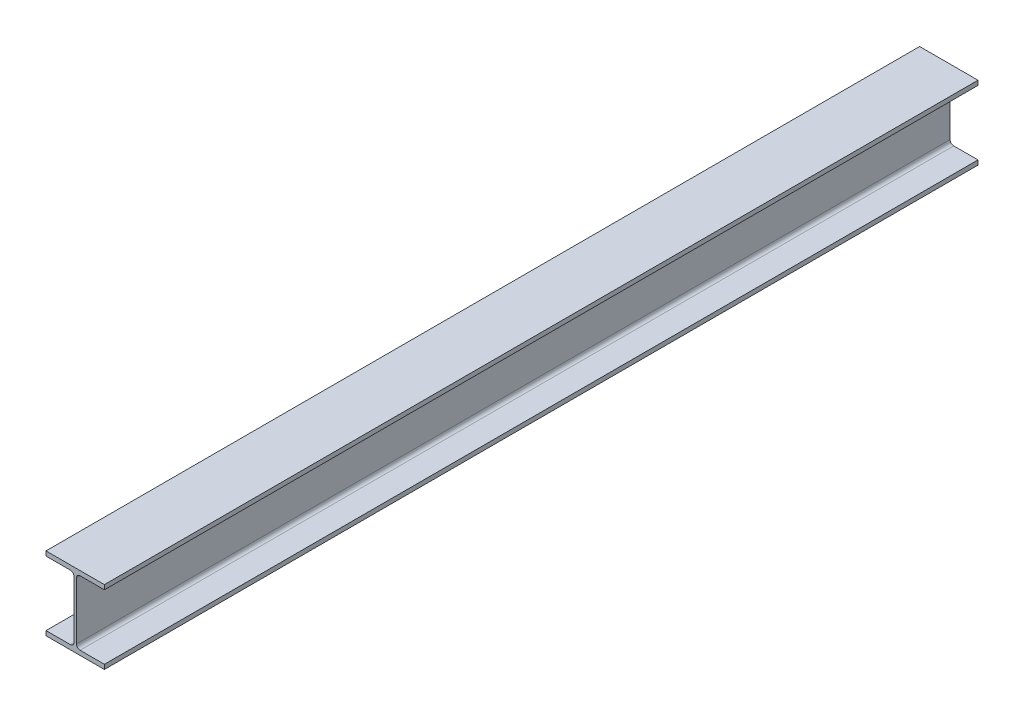
ISO-10303-21;
HEADER;
FILE_DESCRIPTION(('STEP AP214'),'2;1');
FILE_NAME('part.step','',(''),(''),'','','');
FILE_SCHEMA(('AUTOMOTIVE_DESIGN { 1 0 10303 214 1 1 1 1 }'));
ENDSEC;
DATA;
#1=APPLICATION_CONTEXT('core data for automotive mechanical design processes');
#2=APPLICATION_PROTOCOL_DEFINITION('international standard','automotive_design',2000,#1);
#3=PRODUCT_CONTEXT('',#1,'mechanical');
#4=PRODUCT('Part','Part','',(#3));
#5=PRODUCT_RELATED_PRODUCT_CATEGORY('part','',(#4));
#6=PRODUCT_DEFINITION_FORMATION('','',#4);
#7=PRODUCT_DEFINITION_CONTEXT('part definition',#1,'design');
#8=PRODUCT_DEFINITION('design','',#6,#7);
#9=PRODUCT_DEFINITION_SHAPE('','',#8);
#10=(LENGTH_UNIT() NAMED_UNIT(*) SI_UNIT(.MILLI.,.METRE.));
#11=(NAMED_UNIT(*) PLANE_ANGLE_UNIT() SI_UNIT($,.RADIAN.));
#12=(NAMED_UNIT(*) SI_UNIT($,.STERADIAN.) SOLID_ANGLE_UNIT());
#13=UNCERTAINTY_MEASURE_WITH_UNIT(LENGTH_MEASURE(1.E-05),#10,'distance_accuracy_value','');
#14=(GEOMETRIC_REPRESENTATION_CONTEXT(3) GLOBAL_UNCERTAINTY_ASSIGNED_CONTEXT((#13)) GLOBAL_UNIT_ASSIGNED_CONTEXT((#10,
#11,#12)) REPRESENTATION_CONTEXT('',''));
#15=CARTESIAN_POINT('',(0.,0.,0.));
#16=DIRECTION('',(0.,0.,1.));
#17=DIRECTION('',(1.,0.,0.));
#18=AXIS2_PLACEMENT_3D('',#15,#16,#17);
#19=CARTESIAN_POINT('',(183.500636302133,10.8236048524095,-1520.69024698075));
#20=DIRECTION('',(0.,-1.,0.));
#21=DIRECTION('',(0.,0.,-1.));
#22=AXIS2_PLACEMENT_3D('',#19,#20,#21);
#23=PLANE('',#22);
#24=DIRECTION('',(1.,0.,0.));
#25=VECTOR('',#24,1.);
#26=CARTESIAN_POINT('',(183.500636302133,10.8236048524095,1527.30975301925));
#27=LINE('',#26,#25);
#28=CARTESIAN_POINT('',(-20.207363697867,10.8236048524095,1527.30975301925));
#29=VERTEX_POINT('',#28);
#30=CARTESIAN_POINT('',(183.500636302133,10.8236048524095,1527.30975301925));
#31=VERTEX_POINT('',#30);
#32=EDGE_CURVE('E207',#29,#31,#27,.T.);
#33=ORIENTED_EDGE('',*,*,#32,.F.);
#34=DIRECTION('',(0.,0.,1.));
#35=VECTOR('',#34,1.);
#36=CARTESIAN_POINT('',(-20.207363697867,10.8236048524095,-1520.69024698075));
#37=LINE('',#36,#35);
#38=CARTESIAN_POINT('',(-20.207363697867,10.8236048524095,-1520.69024698075));
#39=VERTEX_POINT('',#38);
#40=EDGE_CURVE('E11',#39,#29,#37,.T.);
#41=ORIENTED_EDGE('',*,*,#40,.F.);
#42=DIRECTION('',(1.,0.,0.));
#43=VECTOR('',#42,1.);
#44=CARTESIAN_POINT('',(183.500636302133,10.8236048524095,-1520.69024698075));
#45=LINE('',#44,#43);
#46=CARTESIAN_POINT('',(183.500636302133,10.8236048524095,-1520.69024698075));
#47=VERTEX_POINT('',#46);
#48=EDGE_CURVE('E251',#39,#47,#45,.T.);
#49=ORIENTED_EDGE('',*,*,#48,.T.);
#50=DIRECTION('',(0.,0.,1.));
#51=VECTOR('',#50,1.);
#52=CARTESIAN_POINT('',(183.500636302133,10.8236048524095,-1520.69024698075));
#53=LINE('',#52,#51);
#54=EDGE_CURVE('E43',#47,#31,#53,.T.);
#55=ORIENTED_EDGE('',*,*,#54,.T.);
#56=EDGE_LOOP('',(#33,#41,#49,#55));
#57=FACE_BOUND('',#56,.T.);
#58=ADVANCED_FACE('F40',(#57),#23,.T.);
#59=CARTESIAN_POINT('',(-20.207363697867,10.8236048524095,-1520.69024698075));
#60=DIRECTION('',(-1.,0.,0.));
#61=DIRECTION('',(0.,-1.,0.));
#62=AXIS2_PLACEMENT_3D('',#59,#60,#61);
#63=PLANE('',#62);
#64=DIRECTION('',(0.,-1.,0.));
#65=VECTOR('',#64,1.);
#66=CARTESIAN_POINT('',(-20.207363697867,10.8236048524095,1527.30975301925));
#67=LINE('',#66,#65);
#68=CARTESIAN_POINT('',(-20.207363697867,26.5716048524095,1527.30975301925));
#69=VERTEX_POINT('',#68);
#70=EDGE_CURVE('E249',#69,#29,#67,.T.);
#71=ORIENTED_EDGE('',*,*,#70,.F.);
#72=DIRECTION('',(0.,0.,1.));
#73=VECTOR('',#72,1.);
#74=CARTESIAN_POINT('',(-20.207363697867,26.5716048524095,-1520.69024698075));
#75=LINE('',#74,#73);
#76=CARTESIAN_POINT('',(-20.207363697867,26.5716048524095,-1520.69024698075));
#77=VERTEX_POINT('',#76);
#78=EDGE_CURVE('E50',#77,#69,#75,.T.);
#79=ORIENTED_EDGE('',*,*,#78,.F.);
#80=DIRECTION('',(0.,-1.,0.));
#81=VECTOR('',#80,1.);
#82=CARTESIAN_POINT('',(-20.207363697867,10.8236048524095,-1520.69024698075));
#83=LINE('',#82,#81);
#84=EDGE_CURVE('E193',#77,#39,#83,.T.);
#85=ORIENTED_EDGE('',*,*,#84,.T.);
#86=ORIENTED_EDGE('',*,*,#40,.T.);
#87=EDGE_LOOP('',(#71,#79,#85,#86));
#88=FACE_BOUND('',#87,.T.);
#89=ADVANCED_FACE('F293',(#88),#63,.T.);
#90=CARTESIAN_POINT('',(-20.207363697867,26.5716048524095,-1520.69024698075));
#91=DIRECTION('',(0.,1.,0.));
#92=DIRECTION('',(-1.,0.,0.));
#93=AXIS2_PLACEMENT_3D('',#90,#91,#92);
#94=PLANE('',#93);
#95=DIRECTION('',(-1.,0.,0.));
#96=VECTOR('',#95,1.);
#97=CARTESIAN_POINT('',(-20.207363697867,26.5716048524095,1527.30975301925));
#98=LINE('',#97,#96);
#99=CARTESIAN_POINT('',(64.501636302133,26.5716048524095,1527.30975301925));
#100=VERTEX_POINT('',#99);
#101=EDGE_CURVE('E179',#100,#69,#98,.T.);
#102=ORIENTED_EDGE('',*,*,#101,.F.);
#103=DIRECTION('',(0.,0.,1.));
#104=VECTOR('',#103,1.);
#105=CARTESIAN_POINT('',(64.501636302133,26.5716048524095,-1520.69024698075));
#106=LINE('',#105,#104);
#107=CARTESIAN_POINT('',(64.501636302133,26.5716048524095,-1520.69024698075));
#108=VERTEX_POINT('',#107);
#109=EDGE_CURVE('E174',#108,#100,#106,.T.);
#110=ORIENTED_EDGE('',*,*,#109,.F.);
#111=DIRECTION('',(-1.,0.,0.));
#112=VECTOR('',#111,1.);
#113=CARTESIAN_POINT('',(-20.207363697867,26.5716048524095,-1520.69024698075));
#114=LINE('',#113,#112);
#115=EDGE_CURVE('E177',#108,#77,#114,.T.);
#116=ORIENTED_EDGE('',*,*,#115,.T.);
#117=ORIENTED_EDGE('',*,*,#78,.T.);
#118=EDGE_LOOP('',(#102,#110,#116,#117));
#119=FACE_BOUND('',#118,.T.);
#120=ADVANCED_FACE('F176',(#119),#94,.T.);
#121=CARTESIAN_POINT('',(64.501636302133,39.2716048524095,-1520.69024698075));
#122=DIRECTION('',(0.,0.,1.));
#123=DIRECTION('',(1.,0.,0.));
#124=AXIS2_PLACEMENT_3D('',#121,#122,#123);
#125=CYLINDRICAL_SURFACE('',#124,12.7);
#126=CARTESIAN_POINT('',(64.501636302133,39.2716048524095,1527.30975301925));
#127=DIRECTION('',(0.,0.,-1.));
#128=DIRECTION('',(1.,0.,0.));
#129=AXIS2_PLACEMENT_3D('',#126,#127,#128);
#130=CIRCLE('',#129,12.7);
#131=CARTESIAN_POINT('',(77.201636302133,39.2716048524095,1527.30975301925));
#132=VERTEX_POINT('',#131);
#133=EDGE_CURVE('E246',#132,#100,#130,.T.);
#134=ORIENTED_EDGE('',*,*,#133,.F.);
#135=DIRECTION('',(0.,0.,1.));
#136=VECTOR('',#135,1.);
#137=CARTESIAN_POINT('',(77.201636302133,39.2716048524095,-1520.69024698075));
#138=LINE('',#137,#136);
#139=CARTESIAN_POINT('',(77.201636302133,39.2716048524095,-1520.69024698075));
#140=VERTEX_POINT('',#139);
#141=EDGE_CURVE('E185',#140,#132,#138,.T.);
#142=ORIENTED_EDGE('',*,*,#141,.F.);
#143=CARTESIAN_POINT('',(64.501636302133,39.2716048524095,-1520.69024698075));
#144=DIRECTION('',(0.,0.,-1.));
#145=DIRECTION('',(1.,0.,0.));
#146=AXIS2_PLACEMENT_3D('',#143,#144,#145);
#147=CIRCLE('',#146,12.7);
#148=EDGE_CURVE('E191',#140,#108,#147,.T.);
#149=ORIENTED_EDGE('',*,*,#148,.T.);
#150=ORIENTED_EDGE('',*,*,#109,.T.);
#151=EDGE_LOOP('',(#134,#142,#149,#150));
#152=FACE_BOUND('',#151,.T.);
#153=ADVANCED_FACE('F196',(#152),#125,.F.);
#154=CARTESIAN_POINT('',(77.201636302133,39.2716048524095,-1520.69024698075));
#155=DIRECTION('',(-1.,0.,0.));
#156=DIRECTION('',(0.,-1.,0.));
#157=AXIS2_PLACEMENT_3D('',#154,#155,#156);
#158=PLANE('',#157);
#159=DIRECTION('',(0.,-1.,0.));
#160=VECTOR('',#159,1.);
#161=CARTESIAN_POINT('',(77.201636302133,39.2716048524095,1527.30975301925));
#162=LINE('',#161,#160);
#163=CARTESIAN_POINT('',(77.2016363021329,238.91560485241,1527.30975301925));
#164=VERTEX_POINT('',#163);
#165=EDGE_CURVE('E243',#164,#132,#162,.T.);
#166=ORIENTED_EDGE('',*,*,#165,.F.);
#167=DIRECTION('',(0.,0.,1.));
#168=VECTOR('',#167,1.);
#169=CARTESIAN_POINT('',(77.2016363021329,238.91560485241,-1520.69024698075));
#170=LINE('',#169,#168);
#171=CARTESIAN_POINT('',(77.2016363021329,238.91560485241,-1520.69024698075));
#172=VERTEX_POINT('',#171);
#173=EDGE_CURVE('E257',#172,#164,#170,.T.);
#174=ORIENTED_EDGE('',*,*,#173,.F.);
#175=DIRECTION('',(0.,-1.,0.));
#176=VECTOR('',#175,1.);
#177=CARTESIAN_POINT('',(77.201636302133,39.2716048524095,-1520.69024698075));
#178=LINE('',#177,#176);
#179=EDGE_CURVE('E198',#172,#140,#178,.T.);
#180=ORIENTED_EDGE('',*,*,#179,.T.);
#181=ORIENTED_EDGE('',*,*,#141,.T.);
#182=EDGE_LOOP('',(#166,#174,#180,#181));
#183=FACE_BOUND('',#182,.T.);
#184=ADVANCED_FACE('F306',(#183),#158,.T.);
#185=CARTESIAN_POINT('',(64.5016363021329,238.91560485241,-1520.69024698075));
#186=DIRECTION('',(0.,0.,1.));
#187=DIRECTION('',(1.,0.,0.));
#188=AXIS2_PLACEMENT_3D('',#185,#186,#187);
#189=CYLINDRICAL_SURFACE('',#188,12.7);
#190=CARTESIAN_POINT('',(64.5016363021329,238.91560485241,1527.30975301925));
#191=DIRECTION('',(0.,0.,-1.));
#192=DIRECTION('',(1.,0.,0.));
#193=AXIS2_PLACEMENT_3D('',#190,#191,#192);
#194=CIRCLE('',#193,12.7);
#195=CARTESIAN_POINT('',(64.5016363021329,251.61560485241,1527.30975301925));
#196=VERTEX_POINT('',#195);
#197=EDGE_CURVE('E240',#196,#164,#194,.T.);
#198=ORIENTED_EDGE('',*,*,#197,.F.);
#199=DIRECTION('',(0.,0.,1.));
#200=VECTOR('',#199,1.);
#201=CARTESIAN_POINT('',(64.5016363021329,251.61560485241,-1520.69024698075));
#202=LINE('',#201,#200);
#203=CARTESIAN_POINT('',(64.5016363021329,251.61560485241,-1520.69024698075));
#204=VERTEX_POINT('',#203);
#205=EDGE_CURVE('E260',#204,#196,#202,.T.);
#206=ORIENTED_EDGE('',*,*,#205,.F.);
#207=CARTESIAN_POINT('',(64.5016363021329,238.91560485241,-1520.69024698075));
#208=DIRECTION('',(0.,0.,-1.));
#209=DIRECTION('',(1.,0.,0.));
#210=AXIS2_PLACEMENT_3D('',#207,#208,#209);
#211=CIRCLE('',#210,12.7);
#212=EDGE_CURVE('E201',#204,#172,#211,.T.);
#213=ORIENTED_EDGE('',*,*,#212,.T.);
#214=ORIENTED_EDGE('',*,*,#173,.T.);
#215=EDGE_LOOP('',(#198,#206,#213,#214));
#216=FACE_BOUND('',#215,.T.);
#217=ADVANCED_FACE('F309',(#216),#189,.F.);
#218=CARTESIAN_POINT('',(64.5016363021329,251.61560485241,-1520.69024698075));
#219=DIRECTION('',(0.,-1.,0.));
#220=DIRECTION('',(0.,0.,-1.));
#221=AXIS2_PLACEMENT_3D('',#218,#219,#220);
#222=PLANE('',#221);
#223=DIRECTION('',(1.,0.,0.));
#224=VECTOR('',#223,1.);
#225=CARTESIAN_POINT('',(64.5016363021329,251.61560485241,1527.30975301925));
#226=LINE('',#225,#224);
#227=CARTESIAN_POINT('',(-20.2073636978671,251.61560485241,1527.30975301925));
#228=VERTEX_POINT('',#227);
#229=EDGE_CURVE('E237',#228,#196,#226,.T.);
#230=ORIENTED_EDGE('',*,*,#229,.F.);
#231=DIRECTION('',(0.,0.,1.));
#232=VECTOR('',#231,1.);
#233=CARTESIAN_POINT('',(-20.2073636978671,251.61560485241,-1520.69024698075));
#234=LINE('',#233,#232);
#235=CARTESIAN_POINT('',(-20.2073636978671,251.61560485241,-1520.69024698075));
#236=VERTEX_POINT('',#235);
#237=EDGE_CURVE('E263',#236,#228,#234,.T.);
#238=ORIENTED_EDGE('',*,*,#237,.F.);
#239=DIRECTION('',(1.,0.,0.));
#240=VECTOR('',#239,1.);
#241=CARTESIAN_POINT('',(64.5016363021329,251.61560485241,-1520.69024698075));
#242=LINE('',#241,#240);
#243=EDGE_CURVE('E496',#236,#204,#242,.T.);
#244=ORIENTED_EDGE('',*,*,#243,.T.);
#245=ORIENTED_EDGE('',*,*,#205,.T.);
#246=EDGE_LOOP('',(#230,#238,#244,#245));
#247=FACE_BOUND('',#246,.T.);
#248=ADVANCED_FACE('F313',(#247),#222,.T.);
#249=CARTESIAN_POINT('',(-20.2073636978671,251.61560485241,-1520.69024698075));
#250=DIRECTION('',(-1.,0.,0.));
#251=DIRECTION('',(0.,-1.,0.));
#252=AXIS2_PLACEMENT_3D('',#249,#250,#251);
#253=PLANE('',#252);
#254=DIRECTION('',(0.,-1.,0.));
#255=VECTOR('',#254,1.);
#256=CARTESIAN_POINT('',(-20.2073636978671,251.61560485241,1527.30975301925));
#257=LINE('',#256,#255);
#258=CARTESIAN_POINT('',(-20.2073636978671,267.363604852409,1527.30975301925));
#259=VERTEX_POINT('',#258);
#260=EDGE_CURVE('E234',#259,#228,#257,.T.);
#261=ORIENTED_EDGE('',*,*,#260,.F.);
#262=DIRECTION('',(0.,0.,1.));
#263=VECTOR('',#262,1.);
#264=CARTESIAN_POINT('',(-20.2073636978671,267.363604852409,-1520.69024698075));
#265=LINE('',#264,#263);
#266=CARTESIAN_POINT('',(-20.2073636978671,267.363604852409,-1520.69024698075));
#267=VERTEX_POINT('',#266);
#268=EDGE_CURVE('E266',#267,#259,#265,.T.);
#269=ORIENTED_EDGE('',*,*,#268,.F.);
#270=DIRECTION('',(0.,-1.,0.));
#271=VECTOR('',#270,1.);
#272=CARTESIAN_POINT('',(-20.2073636978671,251.61560485241,-1520.69024698075));
#273=LINE('',#272,#271);
#274=EDGE_CURVE('E492',#267,#236,#273,.T.);
#275=ORIENTED_EDGE('',*,*,#274,.T.);
#276=ORIENTED_EDGE('',*,*,#237,.T.);
#277=EDGE_LOOP('',(#261,#269,#275,#276));
#278=FACE_BOUND('',#277,.T.);
#279=ADVANCED_FACE('F317',(#278),#253,.T.);
#280=CARTESIAN_POINT('',(-20.2073636978671,267.363604852409,-1520.69024698075));
#281=DIRECTION('',(0.,1.,0.));
#282=DIRECTION('',(0.,0.,1.));
#283=AXIS2_PLACEMENT_3D('',#280,#281,#282);
#284=PLANE('',#283);
#285=DIRECTION('',(-1.,0.,0.));
#286=VECTOR('',#285,1.);
#287=CARTESIAN_POINT('',(-20.2073636978671,267.363604852409,1527.30975301925));
#288=LINE('',#287,#286);
#289=CARTESIAN_POINT('',(183.500636302133,267.363604852409,1527.30975301925));
#290=VERTEX_POINT('',#289);
#291=EDGE_CURVE('E231',#290,#259,#288,.T.);
#292=ORIENTED_EDGE('',*,*,#291,.F.);
#293=DIRECTION('',(0.,0.,1.));
#294=VECTOR('',#293,1.);
#295=CARTESIAN_POINT('',(183.500636302133,267.363604852409,-1520.69024698075));
#296=LINE('',#295,#294);
#297=CARTESIAN_POINT('',(183.500636302133,267.363604852409,-1520.69024698075));
#298=VERTEX_POINT('',#297);
#299=EDGE_CURVE('E269',#298,#290,#296,.T.);
#300=ORIENTED_EDGE('',*,*,#299,.F.);
#301=DIRECTION('',(-1.,0.,0.));
#302=VECTOR('',#301,1.);
#303=CARTESIAN_POINT('',(-20.2073636978671,267.363604852409,-1520.69024698075));
#304=LINE('',#303,#302);
#305=EDGE_CURVE('E507',#298,#267,#304,.T.);
#306=ORIENTED_EDGE('',*,*,#305,.T.);
#307=ORIENTED_EDGE('',*,*,#268,.T.);
#308=EDGE_LOOP('',(#292,#300,#306,#307));
#309=FACE_BOUND('',#308,.T.);
#310=ADVANCED_FACE('F321',(#309),#284,.T.);
#311=CARTESIAN_POINT('',(183.500636302133,267.363604852409,-1520.69024698075));
#312=DIRECTION('',(1.,0.,0.));
#313=DIRECTION('',(0.,1.,0.));
#314=AXIS2_PLACEMENT_3D('',#311,#312,#313);
#315=PLANE('',#314);
#316=DIRECTION('',(0.,1.,0.));
#317=VECTOR('',#316,1.);
#318=CARTESIAN_POINT('',(183.500636302133,267.363604852409,1527.30975301925));
#319=LINE('',#318,#317);
#320=CARTESIAN_POINT('',(183.500636302133,251.61560485241,1527.30975301925));
#321=VERTEX_POINT('',#320);
#322=EDGE_CURVE('E228',#321,#290,#319,.T.);
#323=ORIENTED_EDGE('',*,*,#322,.F.);
#324=DIRECTION('',(0.,0.,1.));
#325=VECTOR('',#324,1.);
#326=CARTESIAN_POINT('',(183.500636302133,251.61560485241,-1520.69024698075));
#327=LINE('',#326,#325);
#328=CARTESIAN_POINT('',(183.500636302133,251.61560485241,-1520.69024698075));
#329=VERTEX_POINT('',#328);
#330=EDGE_CURVE('E272',#329,#321,#327,.T.);
#331=ORIENTED_EDGE('',*,*,#330,.F.);
#332=DIRECTION('',(0.,1.,0.));
#333=VECTOR('',#332,1.);
#334=CARTESIAN_POINT('',(183.500636302133,267.363604852409,-1520.69024698075));
#335=LINE('',#334,#333);
#336=EDGE_CURVE('E485',#329,#298,#335,.T.);
#337=ORIENTED_EDGE('',*,*,#336,.T.);
#338=ORIENTED_EDGE('',*,*,#299,.T.);
#339=EDGE_LOOP('',(#323,#331,#337,#338));
#340=FACE_BOUND('',#339,.T.);
#341=ADVANCED_FACE('F325',(#340),#315,.T.);
#342=CARTESIAN_POINT('',(183.500636302133,251.61560485241,-1520.69024698075));
#343=DIRECTION('',(0.,-1.,0.));
#344=DIRECTION('',(0.,0.,-1.));
#345=AXIS2_PLACEMENT_3D('',#342,#343,#344);
#346=PLANE('',#345);
#347=DIRECTION('',(1.,0.,0.));
#348=VECTOR('',#347,1.);
#349=CARTESIAN_POINT('',(183.500636302133,251.61560485241,1527.30975301925));
#350=LINE('',#349,#348);
#351=CARTESIAN_POINT('',(98.7916363021329,251.61560485241,1527.30975301925));
#352=VERTEX_POINT('',#351);
#353=EDGE_CURVE('E225',#352,#321,#350,.T.);
#354=ORIENTED_EDGE('',*,*,#353,.F.);
#355=DIRECTION('',(0.,0.,1.));
#356=VECTOR('',#355,1.);
#357=CARTESIAN_POINT('',(98.7916363021329,251.61560485241,-1520.69024698075));
#358=LINE('',#357,#356);
#359=CARTESIAN_POINT('',(98.7916363021329,251.61560485241,-1520.69024698075));
#360=VERTEX_POINT('',#359);
#361=EDGE_CURVE('E275',#360,#352,#358,.T.);
#362=ORIENTED_EDGE('',*,*,#361,.F.);
#363=DIRECTION('',(1.,0.,0.));
#364=VECTOR('',#363,1.);
#365=CARTESIAN_POINT('',(183.500636302133,251.61560485241,-1520.69024698075));
#366=LINE('',#365,#364);
#367=EDGE_CURVE('E481',#360,#329,#366,.T.);
#368=ORIENTED_EDGE('',*,*,#367,.T.);
#369=ORIENTED_EDGE('',*,*,#330,.T.);
#370=EDGE_LOOP('',(#354,#362,#368,#369));
#371=FACE_BOUND('',#370,.T.);
#372=ADVANCED_FACE('F329',(#371),#346,.T.);
#373=CARTESIAN_POINT('',(98.7916363021329,238.91560485241,-1520.69024698075));
#374=DIRECTION('',(0.,0.,1.));
#375=DIRECTION('',(1.,0.,0.));
#376=AXIS2_PLACEMENT_3D('',#373,#374,#375);
#377=CYLINDRICAL_SURFACE('',#376,12.7);
#378=CARTESIAN_POINT('',(98.7916363021329,238.91560485241,1527.30975301925));
#379=DIRECTION('',(0.,0.,-1.));
#380=DIRECTION('',(1.,0.,0.));
#381=AXIS2_PLACEMENT_3D('',#378,#379,#380);
#382=CIRCLE('',#381,12.7);
#383=CARTESIAN_POINT('',(86.0916363021329,238.91560485241,1527.30975301925));
#384=VERTEX_POINT('',#383);
#385=EDGE_CURVE('E222',#384,#352,#382,.T.);
#386=ORIENTED_EDGE('',*,*,#385,.F.);
#387=DIRECTION('',(0.,0.,1.));
#388=VECTOR('',#387,1.);
#389=CARTESIAN_POINT('',(86.0916363021329,238.91560485241,-1520.69024698075));
#390=LINE('',#389,#388);
#391=CARTESIAN_POINT('',(86.0916363021329,238.91560485241,-1520.69024698075));
#392=VERTEX_POINT('',#391);
#393=EDGE_CURVE('E278',#392,#384,#390,.T.);
#394=ORIENTED_EDGE('',*,*,#393,.F.);
#395=CARTESIAN_POINT('',(98.7916363021329,238.91560485241,-1520.69024698075));
#396=DIRECTION('',(0.,0.,-1.));
#397=DIRECTION('',(1.,0.,0.));
#398=AXIS2_PLACEMENT_3D('',#395,#396,#397);
#399=CIRCLE('',#398,12.7);
#400=EDGE_CURVE('E513',#392,#360,#399,.T.);
#401=ORIENTED_EDGE('',*,*,#400,.T.);
#402=ORIENTED_EDGE('',*,*,#361,.T.);
#403=EDGE_LOOP('',(#386,#394,#401,#402));
#404=FACE_BOUND('',#403,.T.);
#405=ADVANCED_FACE('F333',(#404),#377,.F.);
#406=CARTESIAN_POINT('',(86.0916363021329,238.91560485241,-1520.69024698075));
#407=DIRECTION('',(1.,0.,0.));
#408=DIRECTION('',(0.,1.,0.));
#409=AXIS2_PLACEMENT_3D('',#406,#407,#408);
#410=PLANE('',#409);
#411=DIRECTION('',(0.,1.,0.));
#412=VECTOR('',#411,1.);
#413=CARTESIAN_POINT('',(86.0916363021329,238.91560485241,1527.30975301925));
#414=LINE('',#413,#412);
#415=CARTESIAN_POINT('',(86.0916363021329,39.2716048524095,1527.30975301925));
#416=VERTEX_POINT('',#415);
#417=EDGE_CURVE('E219',#416,#384,#414,.T.);
#418=ORIENTED_EDGE('',*,*,#417,.F.);
#419=DIRECTION('',(0.,0.,1.));
#420=VECTOR('',#419,1.);
#421=CARTESIAN_POINT('',(86.0916363021329,39.2716048524095,-1520.69024698075));
#422=LINE('',#421,#420);
#423=CARTESIAN_POINT('',(86.0916363021329,39.2716048524095,-1520.69024698075));
#424=VERTEX_POINT('',#423);
#425=EDGE_CURVE('E281',#424,#416,#422,.T.);
#426=ORIENTED_EDGE('',*,*,#425,.F.);
#427=DIRECTION('',(0.,1.,0.));
#428=VECTOR('',#427,1.);
#429=CARTESIAN_POINT('',(86.0916363021329,238.91560485241,-1520.69024698075));
#430=LINE('',#429,#428);
#431=EDGE_CURVE('E474',#424,#392,#430,.T.);
#432=ORIENTED_EDGE('',*,*,#431,.T.);
#433=ORIENTED_EDGE('',*,*,#393,.T.);
#434=EDGE_LOOP('',(#418,#426,#432,#433));
#435=FACE_BOUND('',#434,.T.);
#436=ADVANCED_FACE('F337',(#435),#410,.T.);
#437=CARTESIAN_POINT('',(98.7916363021329,39.2716048524095,-1520.69024698075));
#438=DIRECTION('',(0.,0.,1.));
#439=DIRECTION('',(1.,0.,0.));
#440=AXIS2_PLACEMENT_3D('',#437,#438,#439);
#441=CYLINDRICAL_SURFACE('',#440,12.7);
#442=CARTESIAN_POINT('',(98.7916363021329,39.2716048524095,1527.30975301925));
#443=DIRECTION('',(0.,0.,-1.));
#444=DIRECTION('',(1.,0.,0.));
#445=AXIS2_PLACEMENT_3D('',#442,#443,#444);
#446=CIRCLE('',#445,12.7);
#447=CARTESIAN_POINT('',(98.7916363021329,26.5716048524095,1527.30975301925));
#448=VERTEX_POINT('',#447);
#449=EDGE_CURVE('E216',#448,#416,#446,.T.);
#450=ORIENTED_EDGE('',*,*,#449,.F.);
#451=DIRECTION('',(0.,0.,1.));
#452=VECTOR('',#451,1.);
#453=CARTESIAN_POINT('',(98.7916363021329,26.5716048524095,-1520.69024698075));
#454=LINE('',#453,#452);
#455=CARTESIAN_POINT('',(98.7916363021329,26.5716048524095,-1520.69024698075));
#456=VERTEX_POINT('',#455);
#457=EDGE_CURVE('E284',#456,#448,#454,.T.);
#458=ORIENTED_EDGE('',*,*,#457,.F.);
#459=CARTESIAN_POINT('',(98.7916363021329,39.2716048524095,-1520.69024698075));
#460=DIRECTION('',(0.,0.,-1.));
#461=DIRECTION('',(1.,0.,0.));
#462=AXIS2_PLACEMENT_3D('',#459,#460,#461);
#463=CIRCLE('',#462,12.7);
#464=EDGE_CURVE('E470',#456,#424,#463,.T.);
#465=ORIENTED_EDGE('',*,*,#464,.T.);
#466=ORIENTED_EDGE('',*,*,#425,.T.);
#467=EDGE_LOOP('',(#450,#458,#465,#466));
#468=FACE_BOUND('',#467,.T.);
#469=ADVANCED_FACE('F341',(#468),#441,.F.);
#470=CARTESIAN_POINT('',(98.7916363021329,26.5716048524095,-1520.69024698075));
#471=DIRECTION('',(0.,1.,0.));
#472=DIRECTION('',(-1.,0.,0.));
#473=AXIS2_PLACEMENT_3D('',#470,#471,#472);
#474=PLANE('',#473);
#475=DIRECTION('',(-1.,0.,0.));
#476=VECTOR('',#475,1.);
#477=CARTESIAN_POINT('',(98.7916363021329,26.5716048524095,1527.30975301925));
#478=LINE('',#477,#476);
#479=CARTESIAN_POINT('',(183.500636302133,26.5716048524095,1527.30975301925));
#480=VERTEX_POINT('',#479);
#481=EDGE_CURVE('E213',#480,#448,#478,.T.);
#482=ORIENTED_EDGE('',*,*,#481,.F.);
#483=DIRECTION('',(0.,0.,1.));
#484=VECTOR('',#483,1.);
#485=CARTESIAN_POINT('',(183.500636302133,26.5716048524095,-1520.69024698075));
#486=LINE('',#485,#484);
#487=CARTESIAN_POINT('',(183.500636302133,26.5716048524095,-1520.69024698075));
#488=VERTEX_POINT('',#487);
#489=EDGE_CURVE('E286',#488,#480,#486,.T.);
#490=ORIENTED_EDGE('',*,*,#489,.F.);
#491=DIRECTION('',(-1.,0.,0.));
#492=VECTOR('',#491,1.);
#493=CARTESIAN_POINT('',(98.7916363021329,26.5716048524095,-1520.69024698075));
#494=LINE('',#493,#492);
#495=EDGE_CURVE('E520',#488,#456,#494,.T.);
#496=ORIENTED_EDGE('',*,*,#495,.T.);
#497=ORIENTED_EDGE('',*,*,#457,.T.);
#498=EDGE_LOOP('',(#482,#490,#496,#497));
#499=FACE_BOUND('',#498,.T.);
#500=ADVANCED_FACE('F345',(#499),#474,.T.);
#501=CARTESIAN_POINT('',(183.500636302133,26.5716048524095,-1520.69024698075));
#502=DIRECTION('',(1.,0.,0.));
#503=DIRECTION('',(0.,0.,-1.));
#504=AXIS2_PLACEMENT_3D('',#501,#502,#503);
#505=PLANE('',#504);
#506=DIRECTION('',(0.,1.,0.));
#507=VECTOR('',#506,1.);
#508=CARTESIAN_POINT('',(183.500636302133,26.5716048524095,1527.30975301925));
#509=LINE('',#508,#507);
#510=EDGE_CURVE('E210',#31,#480,#509,.T.);
#511=ORIENTED_EDGE('',*,*,#510,.F.);
#512=ORIENTED_EDGE('',*,*,#54,.F.);
#513=DIRECTION('',(0.,1.,0.));
#514=VECTOR('',#513,1.);
#515=CARTESIAN_POINT('',(183.500636302133,26.5716048524095,-1520.69024698075));
#516=LINE('',#515,#514);
#517=EDGE_CURVE('E523',#47,#488,#516,.T.);
#518=ORIENTED_EDGE('',*,*,#517,.T.);
#519=ORIENTED_EDGE('',*,*,#489,.T.);
#520=EDGE_LOOP('',(#511,#512,#518,#519));
#521=FACE_BOUND('',#520,.T.);
#522=ADVANCED_FACE('F290',(#521),#505,.T.);
#523=CARTESIAN_POINT('',(64.501636302133,39.2716048524095,-1520.69024698075));
#524=DIRECTION('',(0.,0.,1.));
#525=DIRECTION('',(1.,0.,0.));
#526=AXIS2_PLACEMENT_3D('',#523,#524,#525);
#527=PLANE('',#526);
#528=ORIENTED_EDGE('',*,*,#48,.F.);
#529=ORIENTED_EDGE('',*,*,#84,.F.);
#530=ORIENTED_EDGE('',*,*,#115,.F.);
#531=ORIENTED_EDGE('',*,*,#148,.F.);
#532=ORIENTED_EDGE('',*,*,#179,.F.);
#533=ORIENTED_EDGE('',*,*,#212,.F.);
#534=ORIENTED_EDGE('',*,*,#243,.F.);
#535=ORIENTED_EDGE('',*,*,#274,.F.);
#536=ORIENTED_EDGE('',*,*,#305,.F.);
#537=ORIENTED_EDGE('',*,*,#336,.F.);
#538=ORIENTED_EDGE('',*,*,#367,.F.);
#539=ORIENTED_EDGE('',*,*,#400,.F.);
#540=ORIENTED_EDGE('',*,*,#431,.F.);
#541=ORIENTED_EDGE('',*,*,#464,.F.);
#542=ORIENTED_EDGE('',*,*,#495,.F.);
#543=ORIENTED_EDGE('',*,*,#517,.F.);
#544=EDGE_LOOP('',(#528,#529,#530,#531,#532,#533,#534,#535,#536,#537,#538,#539,#540,#541,#542,#543));
#545=FACE_BOUND('',#544,.T.);
#546=ADVANCED_FACE('F189',(#545),#527,.F.);
#547=CARTESIAN_POINT('',(64.501636302133,39.2716048524095,1527.30975301925));
#548=DIRECTION('',(0.,0.,1.));
#549=DIRECTION('',(1.,0.,0.));
#550=AXIS2_PLACEMENT_3D('',#547,#548,#549);
#551=PLANE('',#550);
#552=ORIENTED_EDGE('',*,*,#32,.T.);
#553=ORIENTED_EDGE('',*,*,#510,.T.);
#554=ORIENTED_EDGE('',*,*,#481,.T.);
#555=ORIENTED_EDGE('',*,*,#449,.T.);
#556=ORIENTED_EDGE('',*,*,#417,.T.);
#557=ORIENTED_EDGE('',*,*,#385,.T.);
#558=ORIENTED_EDGE('',*,*,#353,.T.);
#559=ORIENTED_EDGE('',*,*,#322,.T.);
#560=ORIENTED_EDGE('',*,*,#291,.T.);
#561=ORIENTED_EDGE('',*,*,#260,.T.);
#562=ORIENTED_EDGE('',*,*,#229,.T.);
#563=ORIENTED_EDGE('',*,*,#197,.T.);
#564=ORIENTED_EDGE('',*,*,#165,.T.);
#565=ORIENTED_EDGE('',*,*,#133,.T.);
#566=ORIENTED_EDGE('',*,*,#101,.T.);
#567=ORIENTED_EDGE('',*,*,#70,.T.);
#568=EDGE_LOOP('',(#552,#553,#554,#555,#556,#557,#558,#559,#560,#561,#562,#563,#564,#565,#566,#567));
#569=FACE_BOUND('',#568,.T.);
#570=ADVANCED_FACE('F292',(#569),#551,.T.);
#571=CLOSED_SHELL('',(#58,#89,#120,#153,#184,#217,#248,#279,#310,#341,#372,#405,#436,#469,#500,
#522,#546,#570));
#572=MANIFOLD_SOLID_BREP('B2',#571);
#573=ADVANCED_BREP_SHAPE_REPRESENTATION('',(#18,#572),#14);
#574=SHAPE_DEFINITION_REPRESENTATION(#9,#573);
ENDSEC;
END-ISO-10303-21;
